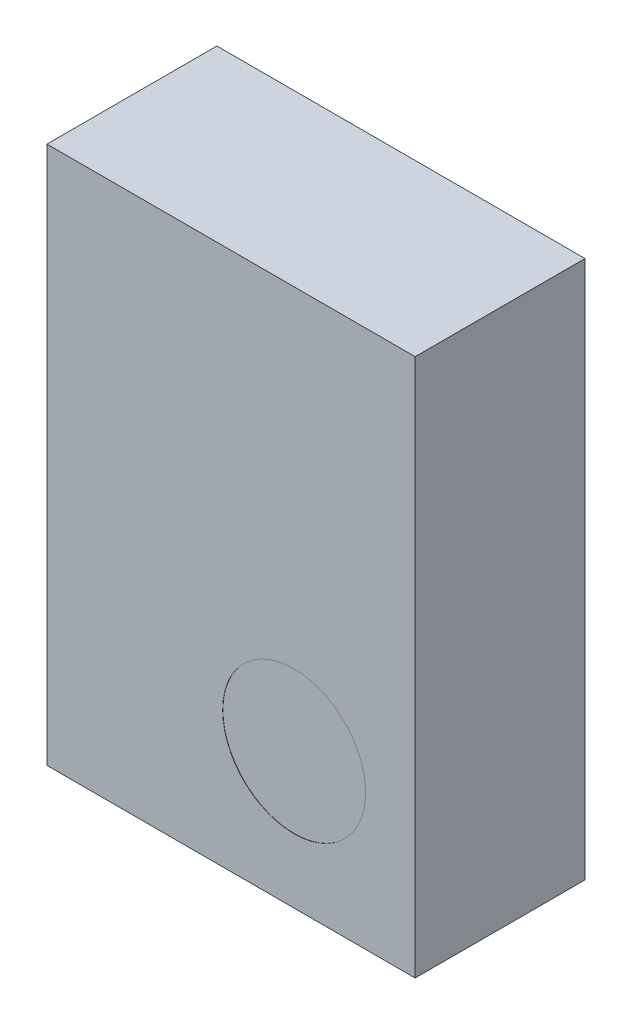
ISO-10303-21;
HEADER;
FILE_DESCRIPTION(('STEP AP214'),'2;1');
FILE_NAME('part.step','',(''),(''),'','','');
FILE_SCHEMA(('AUTOMOTIVE_DESIGN { 1 0 10303 214 1 1 1 1 }'));
ENDSEC;
DATA;
#1=APPLICATION_CONTEXT('core data for automotive mechanical design processes');
#2=APPLICATION_PROTOCOL_DEFINITION('international standard','automotive_design',2000,#1);
#3=PRODUCT_CONTEXT('',#1,'mechanical');
#4=PRODUCT('Part','Part','',(#3));
#5=PRODUCT_RELATED_PRODUCT_CATEGORY('part','',(#4));
#6=PRODUCT_DEFINITION_FORMATION('','',#4);
#7=PRODUCT_DEFINITION_CONTEXT('part definition',#1,'design');
#8=PRODUCT_DEFINITION('design','',#6,#7);
#9=PRODUCT_DEFINITION_SHAPE('','',#8);
#10=(LENGTH_UNIT() NAMED_UNIT(*) SI_UNIT(.MILLI.,.METRE.));
#11=(NAMED_UNIT(*) PLANE_ANGLE_UNIT() SI_UNIT($,.RADIAN.));
#12=(NAMED_UNIT(*) SI_UNIT($,.STERADIAN.) SOLID_ANGLE_UNIT());
#13=UNCERTAINTY_MEASURE_WITH_UNIT(LENGTH_MEASURE(1.E-05),#10,'distance_accuracy_value','');
#14=(GEOMETRIC_REPRESENTATION_CONTEXT(3) GLOBAL_UNCERTAINTY_ASSIGNED_CONTEXT((#13)) GLOBAL_UNIT_ASSIGNED_CONTEXT((#10,
#11,#12)) REPRESENTATION_CONTEXT('',''));
#15=CARTESIAN_POINT('',(0.,0.,0.));
#16=DIRECTION('',(0.,0.,1.));
#17=DIRECTION('',(1.,0.,0.));
#18=AXIS2_PLACEMENT_3D('',#15,#16,#17);
#19=CARTESIAN_POINT('',(20.6375,60.325,9.525));
#20=DIRECTION('',(-1.,0.,0.));
#21=DIRECTION('',(0.,0.,1.));
#22=AXIS2_PLACEMENT_3D('',#19,#20,#21);
#23=PLANE('',#22);
#24=DIRECTION('',(0.,0.,-1.));
#25=VECTOR('',#24,1.);
#26=CARTESIAN_POINT('',(20.6375,0.,9.525));
#27=LINE('',#26,#25);
#28=CARTESIAN_POINT('',(20.6375,0.,9.525));
#29=VERTEX_POINT('',#28);
#30=CARTESIAN_POINT('',(20.6375,0.,-9.525));
#31=VERTEX_POINT('',#30);
#32=EDGE_CURVE('E97',#29,#31,#27,.T.);
#33=ORIENTED_EDGE('',*,*,#32,.T.);
#34=DIRECTION('',(0.,-1.,0.));
#35=VECTOR('',#34,1.);
#36=CARTESIAN_POINT('',(20.6375,60.325,-9.525));
#37=LINE('',#36,#35);
#38=CARTESIAN_POINT('',(20.6375,60.325,-9.525));
#39=VERTEX_POINT('',#38);
#40=EDGE_CURVE('E11',#39,#31,#37,.T.);
#41=ORIENTED_EDGE('',*,*,#40,.F.);
#42=DIRECTION('',(0.,0.,-1.));
#43=VECTOR('',#42,1.);
#44=CARTESIAN_POINT('',(20.6375,60.325,9.525));
#45=LINE('',#44,#43);
#46=CARTESIAN_POINT('',(20.6375,60.325,9.525));
#47=VERTEX_POINT('',#46);
#48=EDGE_CURVE('E85',#47,#39,#45,.T.);
#49=ORIENTED_EDGE('',*,*,#48,.F.);
#50=DIRECTION('',(0.,-1.,0.));
#51=VECTOR('',#50,1.);
#52=CARTESIAN_POINT('',(20.6375,60.325,9.525));
#53=LINE('',#52,#51);
#54=EDGE_CURVE('E93',#47,#29,#53,.T.);
#55=ORIENTED_EDGE('',*,*,#54,.T.);
#56=EDGE_LOOP('',(#33,#41,#49,#55));
#57=FACE_BOUND('',#56,.T.);
#58=ADVANCED_FACE('F34',(#57),#23,.F.);
#59=CARTESIAN_POINT('',(-20.6375,60.325,-9.525));
#60=DIRECTION('',(0.,0.,1.));
#61=DIRECTION('',(1.,0.,0.));
#62=AXIS2_PLACEMENT_3D('',#59,#60,#61);
#63=PLANE('',#62);
#64=DIRECTION('',(-1.,0.,0.));
#65=VECTOR('',#64,1.);
#66=CARTESIAN_POINT('',(-20.6375,0.,-9.525));
#67=LINE('',#66,#65);
#68=CARTESIAN_POINT('',(-20.6375,0.,-9.525));
#69=VERTEX_POINT('',#68);
#70=EDGE_CURVE('E89',#31,#69,#67,.T.);
#71=ORIENTED_EDGE('',*,*,#70,.T.);
#72=DIRECTION('',(0.,-1.,0.));
#73=VECTOR('',#72,1.);
#74=CARTESIAN_POINT('',(-20.6375,60.325,-9.525));
#75=LINE('',#74,#73);
#76=CARTESIAN_POINT('',(-20.6375,60.325,-9.525));
#77=VERTEX_POINT('',#76);
#78=EDGE_CURVE('E42',#77,#69,#75,.T.);
#79=ORIENTED_EDGE('',*,*,#78,.F.);
#80=DIRECTION('',(-1.,0.,0.));
#81=VECTOR('',#80,1.);
#82=CARTESIAN_POINT('',(-20.6375,60.325,-9.525));
#83=LINE('',#82,#81);
#84=EDGE_CURVE('E80',#39,#77,#83,.T.);
#85=ORIENTED_EDGE('',*,*,#84,.F.);
#86=ORIENTED_EDGE('',*,*,#40,.T.);
#87=EDGE_LOOP('',(#71,#79,#85,#86));
#88=FACE_BOUND('',#87,.T.);
#89=ADVANCED_FACE('F88',(#88),#63,.F.);
#90=CARTESIAN_POINT('',(-20.6375,60.325,9.525));
#91=DIRECTION('',(1.,0.,0.));
#92=DIRECTION('',(0.,0.,-1.));
#93=AXIS2_PLACEMENT_3D('',#90,#91,#92);
#94=PLANE('',#93);
#95=DIRECTION('',(0.,0.,1.));
#96=VECTOR('',#95,1.);
#97=CARTESIAN_POINT('',(-20.6375,0.,9.525));
#98=LINE('',#97,#96);
#99=CARTESIAN_POINT('',(-20.6375,0.,9.525));
#100=VERTEX_POINT('',#99);
#101=EDGE_CURVE('E67',#69,#100,#98,.T.);
#102=ORIENTED_EDGE('',*,*,#101,.T.);
#103=DIRECTION('',(0.,-1.,0.));
#104=VECTOR('',#103,1.);
#105=CARTESIAN_POINT('',(-20.6375,60.325,9.525));
#106=LINE('',#105,#104);
#107=CARTESIAN_POINT('',(-20.6375,60.325,9.525));
#108=VERTEX_POINT('',#107);
#109=EDGE_CURVE('E90',#108,#100,#106,.T.);
#110=ORIENTED_EDGE('',*,*,#109,.F.);
#111=DIRECTION('',(0.,0.,1.));
#112=VECTOR('',#111,1.);
#113=CARTESIAN_POINT('',(-20.6375,60.325,9.525));
#114=LINE('',#113,#112);
#115=EDGE_CURVE('E83',#77,#108,#114,.T.);
#116=ORIENTED_EDGE('',*,*,#115,.F.);
#117=ORIENTED_EDGE('',*,*,#78,.T.);
#118=EDGE_LOOP('',(#102,#110,#116,#117));
#119=FACE_BOUND('',#118,.T.);
#120=ADVANCED_FACE('F91',(#119),#94,.F.);
#121=CARTESIAN_POINT('',(-20.6375,60.325,9.525));
#122=DIRECTION('',(0.,0.,-1.));
#123=DIRECTION('',(-1.,0.,0.));
#124=AXIS2_PLACEMENT_3D('',#121,#122,#123);
#125=PLANE('',#124);
#126=CARTESIAN_POINT('',(7.07354402712179,15.2270293297305,9.525));
#127=DIRECTION('',(0.,0.,1.));
#128=DIRECTION('',(1.,0.,0.));
#129=AXIS2_PLACEMENT_3D('',#126,#127,#128);
#130=CIRCLE('',#129,8.01247039186093);
#131=CARTESIAN_POINT('',(15.0860144189827,15.2270293297305,9.525));
#132=VERTEX_POINT('',#131);
#133=EDGE_CURVE('E111',#132,#132,#130,.T.);
#134=ORIENTED_EDGE('',*,*,#133,.F.);
#135=EDGE_LOOP('',(#134));
#136=FACE_BOUND('',#135,.T.);
#137=DIRECTION('',(1.,0.,0.));
#138=VECTOR('',#137,1.);
#139=CARTESIAN_POINT('',(-20.6375,0.,9.525));
#140=LINE('',#139,#138);
#141=EDGE_CURVE('E73',#100,#29,#140,.T.);
#142=ORIENTED_EDGE('',*,*,#141,.T.);
#143=ORIENTED_EDGE('',*,*,#54,.F.);
#144=DIRECTION('',(1.,0.,0.));
#145=VECTOR('',#144,1.);
#146=CARTESIAN_POINT('',(-20.6375,60.325,9.525));
#147=LINE('',#146,#145);
#148=EDGE_CURVE('E50',#108,#47,#147,.T.);
#149=ORIENTED_EDGE('',*,*,#148,.F.);
#150=ORIENTED_EDGE('',*,*,#109,.T.);
#151=EDGE_LOOP('',(#142,#143,#149,#150));
#152=FACE_BOUND('',#151,.T.);
#153=ADVANCED_FACE('F105',(#136,#152),#125,.F.);
#154=CARTESIAN_POINT('',(0.,60.325,0.));
#155=DIRECTION('',(0.,-1.,0.));
#156=DIRECTION('',(0.,0.,-1.));
#157=AXIS2_PLACEMENT_3D('',#154,#155,#156);
#158=PLANE('',#157);
#159=ORIENTED_EDGE('',*,*,#48,.T.);
#160=ORIENTED_EDGE('',*,*,#84,.T.);
#161=ORIENTED_EDGE('',*,*,#115,.T.);
#162=ORIENTED_EDGE('',*,*,#148,.T.);
#163=EDGE_LOOP('',(#159,#160,#161,#162));
#164=FACE_BOUND('',#163,.T.);
#165=ADVANCED_FACE('F81',(#164),#158,.F.);
#166=CARTESIAN_POINT('',(0.,0.,0.));
#167=DIRECTION('',(0.,-1.,0.));
#168=DIRECTION('',(0.,0.,-1.));
#169=AXIS2_PLACEMENT_3D('',#166,#167,#168);
#170=PLANE('',#169);
#171=ORIENTED_EDGE('',*,*,#32,.F.);
#172=ORIENTED_EDGE('',*,*,#141,.F.);
#173=ORIENTED_EDGE('',*,*,#101,.F.);
#174=ORIENTED_EDGE('',*,*,#70,.F.);
#175=EDGE_LOOP('',(#171,#172,#173,#174));
#176=FACE_BOUND('',#175,.T.);
#177=ADVANCED_FACE('F108',(#176),#170,.T.);
#178=CARTESIAN_POINT('',(7.07354402712179,15.2270293297305,9.4996));
#179=DIRECTION('',(0.,0.,1.));
#180=DIRECTION('',(1.,0.,0.));
#181=AXIS2_PLACEMENT_3D('',#178,#179,#180);
#182=CYLINDRICAL_SURFACE('',#181,8.01247039186093);
#183=CARTESIAN_POINT('',(7.07354402712179,15.2270293297305,9.4996));
#184=DIRECTION('',(0.,0.,1.));
#185=DIRECTION('',(1.,0.,0.));
#186=AXIS2_PLACEMENT_3D('',#183,#184,#185);
#187=CIRCLE('',#186,8.01247039186093);
#188=CARTESIAN_POINT('',(15.0860144189827,15.2270293297305,9.4996));
#189=VERTEX_POINT('',#188);
#190=EDGE_CURVE('E100',#189,#189,#187,.T.);
#191=ORIENTED_EDGE('',*,*,#190,.F.);
#192=EDGE_LOOP('',(#191));
#193=FACE_BOUND('',#192,.T.);
#194=ORIENTED_EDGE('',*,*,#133,.T.);
#195=EDGE_LOOP('',(#194));
#196=FACE_BOUND('',#195,.T.);
#197=ADVANCED_FACE('F119',(#193,#196),#182,.F.);
#198=CARTESIAN_POINT('',(7.07354402712179,15.2270293297305,9.4996));
#199=DIRECTION('',(0.,0.,1.));
#200=DIRECTION('',(1.,0.,0.));
#201=AXIS2_PLACEMENT_3D('',#198,#199,#200);
#202=PLANE('',#201);
#203=ORIENTED_EDGE('',*,*,#190,.T.);
#204=EDGE_LOOP('',(#203));
#205=FACE_BOUND('',#204,.T.);
#206=ADVANCED_FACE('F117',(#205),#202,.T.);
#207=CLOSED_SHELL('',(#58,#89,#120,#153,#165,#177,#197,#206));
#208=MANIFOLD_SOLID_BREP('B2',#207);
#209=ADVANCED_BREP_SHAPE_REPRESENTATION('',(#18,#208),#14);
#210=SHAPE_DEFINITION_REPRESENTATION(#9,#209);
ENDSEC;
END-ISO-10303-21;
